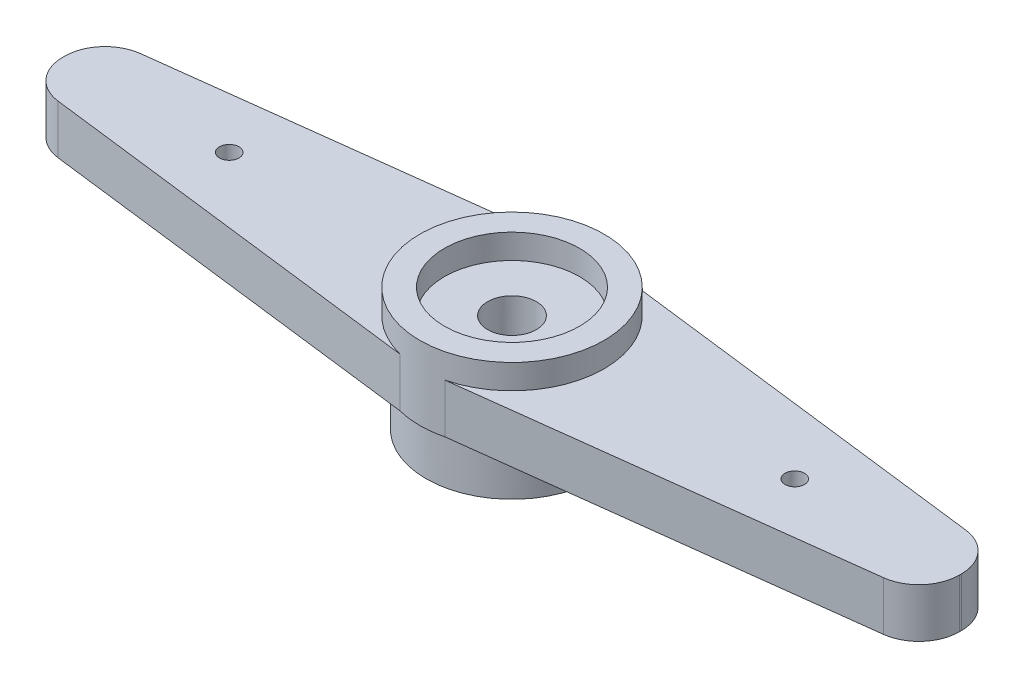
ISO-10303-21;
HEADER;
FILE_DESCRIPTION(('STEP AP214'),'2;1');
FILE_NAME('part.step','',(''),(''),'','','');
FILE_SCHEMA(('AUTOMOTIVE_DESIGN { 1 0 10303 214 1 1 1 1 }'));
ENDSEC;
DATA;
#1=APPLICATION_CONTEXT('core data for automotive mechanical design processes');
#2=APPLICATION_PROTOCOL_DEFINITION('international standard','automotive_design',2000,#1);
#3=PRODUCT_CONTEXT('',#1,'mechanical');
#4=PRODUCT('Part','Part','',(#3));
#5=PRODUCT_RELATED_PRODUCT_CATEGORY('part','',(#4));
#6=PRODUCT_DEFINITION_FORMATION('','',#4);
#7=PRODUCT_DEFINITION_CONTEXT('part definition',#1,'design');
#8=PRODUCT_DEFINITION('design','',#6,#7);
#9=PRODUCT_DEFINITION_SHAPE('','',#8);
#10=(LENGTH_UNIT() NAMED_UNIT(*) SI_UNIT(.MILLI.,.METRE.));
#11=(NAMED_UNIT(*) PLANE_ANGLE_UNIT() SI_UNIT($,.RADIAN.));
#12=(NAMED_UNIT(*) SI_UNIT($,.STERADIAN.) SOLID_ANGLE_UNIT());
#13=UNCERTAINTY_MEASURE_WITH_UNIT(LENGTH_MEASURE(1.E-05),#10,'distance_accuracy_value','');
#14=(GEOMETRIC_REPRESENTATION_CONTEXT(3) GLOBAL_UNCERTAINTY_ASSIGNED_CONTEXT((#13)) GLOBAL_UNIT_ASSIGNED_CONTEXT((#10,
#11,#12)) REPRESENTATION_CONTEXT('',''));
#15=CARTESIAN_POINT('',(0.,0.,0.));
#16=DIRECTION('',(0.,0.,1.));
#17=DIRECTION('',(1.,0.,0.));
#18=AXIS2_PLACEMENT_3D('',#15,#16,#17);
#19=CARTESIAN_POINT('',(-16.8022009519438,4.,-1.67531973664374));
#20=DIRECTION('',(-0.122546031481075,0.,-0.992462830623011));
#21=DIRECTION('',(-0.992462830623011,0.,0.122546031481075));
#22=AXIS2_PLACEMENT_3D('',#19,#20,#21);
#23=PLANE('',#22);
#24=DIRECTION('',(0.,1.,0.));
#25=VECTOR('',#24,1.);
#26=CARTESIAN_POINT('',(-0.912167859639924,3.,-3.6373685262618));
#27=LINE('',#26,#25);
#28=CARTESIAN_POINT('',(-0.912167859639935,4.,-3.63736852626179));
#29=VERTEX_POINT('',#28);
#30=CARTESIAN_POINT('',(-0.912167859639928,2.,-3.6373685262618));
#31=VERTEX_POINT('',#30);
#32=EDGE_CURVE('E241',#29,#31,#27,.F.);
#33=ORIENTED_EDGE('',*,*,#32,.T.);
#34=DIRECTION('',(0.992462830623011,0.,-0.122546031481075));
#35=VECTOR('',#34,1.);
#36=CARTESIAN_POINT('',(-16.8022009519438,2.,-1.67531973664374));
#37=LINE('',#36,#35);
#38=CARTESIAN_POINT('',(-16.8022009519438,2.,-1.67531973664374));
#39=VERTEX_POINT('',#38);
#40=EDGE_CURVE('E180',#39,#31,#37,.T.);
#41=ORIENTED_EDGE('',*,*,#40,.F.);
#42=DIRECTION('',(0.,-1.,0.));
#43=VECTOR('',#42,1.);
#44=CARTESIAN_POINT('',(-16.8022009519438,4.,-1.67531973664374));
#45=LINE('',#44,#43);
#46=CARTESIAN_POINT('',(-16.8022009519438,4.,-1.67531973664374));
#47=VERTEX_POINT('',#46);
#48=EDGE_CURVE('E209',#47,#39,#45,.T.);
#49=ORIENTED_EDGE('',*,*,#48,.F.);
#50=DIRECTION('',(0.992462830623011,0.,-0.122546031481075));
#51=VECTOR('',#50,1.);
#52=CARTESIAN_POINT('',(-16.8022009519438,4.,-1.67531973664374));
#53=LINE('',#52,#51);
#54=EDGE_CURVE('E189',#47,#29,#53,.T.);
#55=ORIENTED_EDGE('',*,*,#54,.T.);
#56=EDGE_LOOP('',(#33,#41,#49,#55));
#57=FACE_BOUND('',#56,.T.);
#58=ADVANCED_FACE('F39',(#57),#23,.T.);
#59=CARTESIAN_POINT('',(0.,4.,3.75));
#60=DIRECTION('',(-0.122546031481075,0.,0.992462830623011));
#61=DIRECTION('',(0.992462830623011,0.,0.122546031481075));
#62=AXIS2_PLACEMENT_3D('',#59,#60,#61);
#63=PLANE('',#62);
#64=DIRECTION('',(-0.992462830623011,0.,-0.122546031481075));
#65=VECTOR('',#64,1.);
#66=CARTESIAN_POINT('',(0.,2.,3.75));
#67=LINE('',#66,#65);
#68=CARTESIAN_POINT('',(-0.912167859639928,2.,3.6373685262618));
#69=VERTEX_POINT('',#68);
#70=CARTESIAN_POINT('',(-16.8022009519438,2.,1.67531973664374));
#71=VERTEX_POINT('',#70);
#72=EDGE_CURVE('E196',#69,#71,#67,.T.);
#73=ORIENTED_EDGE('',*,*,#72,.F.);
#74=DIRECTION('',(0.,1.,0.));
#75=VECTOR('',#74,1.);
#76=CARTESIAN_POINT('',(-0.912167859639924,3.,3.6373685262618));
#77=LINE('',#76,#75);
#78=CARTESIAN_POINT('',(-0.912167859639931,4.,3.6373685262618));
#79=VERTEX_POINT('',#78);
#80=EDGE_CURVE('E239',#69,#79,#77,.T.);
#81=ORIENTED_EDGE('',*,*,#80,.T.);
#82=DIRECTION('',(-0.992462830623011,0.,-0.122546031481075));
#83=VECTOR('',#82,1.);
#84=CARTESIAN_POINT('',(0.,4.,3.75));
#85=LINE('',#84,#83);
#86=CARTESIAN_POINT('',(-16.8022009519438,4.,1.67531973664374));
#87=VERTEX_POINT('',#86);
#88=EDGE_CURVE('E63',#79,#87,#85,.T.);
#89=ORIENTED_EDGE('',*,*,#88,.T.);
#90=DIRECTION('',(0.,-1.,0.));
#91=VECTOR('',#90,1.);
#92=CARTESIAN_POINT('',(-16.8022009519438,4.,1.67531973664374));
#93=LINE('',#92,#91);
#94=EDGE_CURVE('E192',#87,#71,#93,.T.);
#95=ORIENTED_EDGE('',*,*,#94,.T.);
#96=EDGE_LOOP('',(#73,#81,#89,#95));
#97=FACE_BOUND('',#96,.T.);
#98=ADVANCED_FACE('F273',(#97),#63,.T.);
#99=CARTESIAN_POINT('',(0.,3.,0.));
#100=DIRECTION('',(0.,1.,0.));
#101=DIRECTION('',(0.,0.,1.));
#102=AXIS2_PLACEMENT_3D('',#99,#100,#101);
#103=CYLINDRICAL_SURFACE('',#102,3.75);
#104=ORIENTED_EDGE('',*,*,#80,.F.);
#105=CARTESIAN_POINT('',(0.,2.,0.));
#106=DIRECTION('',(0.,-1.,0.));
#107=DIRECTION('',(0.,0.,-1.));
#108=AXIS2_PLACEMENT_3D('',#105,#106,#107);
#109=CIRCLE('',#108,3.75);
#110=CARTESIAN_POINT('',(0.912167859639931,2.,3.6373685262618));
#111=VERTEX_POINT('',#110);
#112=EDGE_CURVE('E173',#111,#69,#109,.T.);
#113=ORIENTED_EDGE('',*,*,#112,.F.);
#114=DIRECTION('',(0.,1.,0.));
#115=VECTOR('',#114,1.);
#116=CARTESIAN_POINT('',(0.912167859639924,3.,3.6373685262618));
#117=LINE('',#116,#115);
#118=CARTESIAN_POINT('',(0.912167859639931,4.,3.6373685262618));
#119=VERTEX_POINT('',#118);
#120=EDGE_CURVE('E11',#111,#119,#117,.T.);
#121=ORIENTED_EDGE('',*,*,#120,.T.);
#122=CARTESIAN_POINT('',(0.,4.,0.));
#123=DIRECTION('',(0.,-1.,0.));
#124=DIRECTION('',(0.,0.,-1.));
#125=AXIS2_PLACEMENT_3D('',#122,#123,#124);
#126=CIRCLE('',#125,3.75);
#127=CARTESIAN_POINT('',(0.912167859639935,4.,-3.63736852626179));
#128=VERTEX_POINT('',#127);
#129=EDGE_CURVE('E244',#119,#128,#126,.F.);
#130=ORIENTED_EDGE('',*,*,#129,.T.);
#131=DIRECTION('',(0.,1.,0.));
#132=VECTOR('',#131,1.);
#133=CARTESIAN_POINT('',(0.912167859639924,3.,-3.6373685262618));
#134=LINE('',#133,#132);
#135=CARTESIAN_POINT('',(0.912167859639935,2.,-3.63736852626179));
#136=VERTEX_POINT('',#135);
#137=EDGE_CURVE('E48',#128,#136,#134,.F.);
#138=ORIENTED_EDGE('',*,*,#137,.T.);
#139=EDGE_CURVE('E193',#31,#136,#109,.T.);
#140=ORIENTED_EDGE('',*,*,#139,.F.);
#141=ORIENTED_EDGE('',*,*,#32,.F.);
#142=CARTESIAN_POINT('',(0.,4.,0.));
#143=DIRECTION('',(0.,-1.,0.));
#144=DIRECTION('',(0.,0.,-1.));
#145=AXIS2_PLACEMENT_3D('',#142,#143,#144);
#146=CIRCLE('',#145,3.75);
#147=EDGE_CURVE('E211',#29,#79,#146,.F.);
#148=ORIENTED_EDGE('',*,*,#147,.T.);
#149=EDGE_LOOP('',(#104,#113,#121,#130,#138,#140,#141,#148));
#150=FACE_BOUND('',#149,.T.);
#151=CARTESIAN_POINT('',(0.,5.,0.));
#152=DIRECTION('',(0.,1.,0.));
#153=DIRECTION('',(0.,0.,1.));
#154=AXIS2_PLACEMENT_3D('',#151,#152,#153);
#155=CIRCLE('',#154,3.75);
#156=CARTESIAN_POINT('',(0.,5.,3.75));
#157=VERTEX_POINT('',#156);
#158=EDGE_CURVE('E227',#157,#157,#155,.T.);
#159=ORIENTED_EDGE('',*,*,#158,.F.);
#160=EDGE_LOOP('',(#159));
#161=FACE_BOUND('',#160,.T.);
#162=ADVANCED_FACE('F250',(#150,#161),#103,.T.);
#163=CARTESIAN_POINT('',(0.,2.,0.));
#164=DIRECTION('',(0.,-1.,0.));
#165=DIRECTION('',(0.,0.,-1.));
#166=AXIS2_PLACEMENT_3D('',#163,#164,#165);
#167=PLANE('',#166);
#168=CARTESIAN_POINT('',(11.509375,2.,0.));
#169=DIRECTION('',(0.,-1.,0.));
#170=DIRECTION('',(0.,0.,-1.));
#171=AXIS2_PLACEMENT_3D('',#168,#169,#170);
#172=CIRCLE('',#171,0.396875);
#173=CARTESIAN_POINT('',(11.509375,2.,-0.396875));
#174=VERTEX_POINT('',#173);
#175=EDGE_CURVE('E349',#174,#174,#172,.F.);
#176=ORIENTED_EDGE('',*,*,#175,.T.);
#177=EDGE_LOOP('',(#176));
#178=FACE_BOUND('',#177,.T.);
#179=CARTESIAN_POINT('',(-11.509375,2.,0.));
#180=DIRECTION('',(0.,-1.,0.));
#181=DIRECTION('',(0.,0.,-1.));
#182=AXIS2_PLACEMENT_3D('',#179,#180,#181);
#183=CIRCLE('',#182,0.396875);
#184=CARTESIAN_POINT('',(-11.509375,2.,-0.396875));
#185=VERTEX_POINT('',#184);
#186=EDGE_CURVE('E352',#185,#185,#183,.T.);
#187=ORIENTED_EDGE('',*,*,#186,.F.);
#188=EDGE_LOOP('',(#187));
#189=FACE_BOUND('',#188,.T.);
#190=ORIENTED_EDGE('',*,*,#112,.T.);
#191=ORIENTED_EDGE('',*,*,#72,.T.);
#192=CARTESIAN_POINT('',(-16.6,2.,0.0377560661157744));
#193=DIRECTION('',(0.,-1.,0.));
#194=DIRECTION('',(0.,0.,-1.));
#195=AXIS2_PLACEMENT_3D('',#192,#193,#194);
#196=CIRCLE('',#195,1.65);
#197=CARTESIAN_POINT('',(-18.25,2.,0.0377560661157645));
#198=VERTEX_POINT('',#197);
#199=EDGE_CURVE('E198',#71,#198,#196,.T.);
#200=ORIENTED_EDGE('',*,*,#199,.T.);
#201=DIRECTION('',(0.,0.,-1.));
#202=VECTOR('',#201,1.);
#203=CARTESIAN_POINT('',(-18.25,2.,0.0377560661157638));
#204=LINE('',#203,#202);
#205=CARTESIAN_POINT('',(-18.25,2.,-0.0377560661157642));
#206=VERTEX_POINT('',#205);
#207=EDGE_CURVE('E201',#198,#206,#204,.T.);
#208=ORIENTED_EDGE('',*,*,#207,.T.);
#209=CARTESIAN_POINT('',(-16.6,2.,-0.0377560661157749));
#210=DIRECTION('',(0.,-1.,0.));
#211=DIRECTION('',(0.,0.,1.));
#212=AXIS2_PLACEMENT_3D('',#209,#210,#211);
#213=CIRCLE('',#212,1.65);
#214=EDGE_CURVE('E204',#206,#39,#213,.T.);
#215=ORIENTED_EDGE('',*,*,#214,.T.);
#216=ORIENTED_EDGE('',*,*,#40,.T.);
#217=ORIENTED_EDGE('',*,*,#139,.T.);
#218=DIRECTION('',(-0.992462830623011,0.,-0.122546031481075));
#219=VECTOR('',#218,1.);
#220=CARTESIAN_POINT('',(16.8022009519438,2.,-1.67531973664374));
#221=LINE('',#220,#219);
#222=CARTESIAN_POINT('',(16.8022009519438,2.,-1.67531973664374));
#223=VERTEX_POINT('',#222);
#224=EDGE_CURVE('E164',#223,#136,#221,.T.);
#225=ORIENTED_EDGE('',*,*,#224,.F.);
#226=CARTESIAN_POINT('',(16.6,2.,-0.0377560661157749));
#227=DIRECTION('',(0.,1.,0.));
#228=DIRECTION('',(0.,0.,1.));
#229=AXIS2_PLACEMENT_3D('',#226,#227,#228);
#230=CIRCLE('',#229,1.65);
#231=CARTESIAN_POINT('',(18.25,2.,-0.0377560661157642));
#232=VERTEX_POINT('',#231);
#233=EDGE_CURVE('E145',#232,#223,#230,.T.);
#234=ORIENTED_EDGE('',*,*,#233,.F.);
#235=DIRECTION('',(0.,0.,-1.));
#236=VECTOR('',#235,1.);
#237=CARTESIAN_POINT('',(18.25,2.,0.0377560661157638));
#238=LINE('',#237,#236);
#239=CARTESIAN_POINT('',(18.25,2.,0.0377560661157645));
#240=VERTEX_POINT('',#239);
#241=EDGE_CURVE('E167',#240,#232,#238,.T.);
#242=ORIENTED_EDGE('',*,*,#241,.F.);
#243=CARTESIAN_POINT('',(16.6,2.,0.0377560661157744));
#244=DIRECTION('',(0.,1.,0.));
#245=DIRECTION('',(0.,0.,-1.));
#246=AXIS2_PLACEMENT_3D('',#243,#244,#245);
#247=CIRCLE('',#246,1.65);
#248=CARTESIAN_POINT('',(16.8022009519438,2.,1.67531973664374));
#249=VERTEX_POINT('',#248);
#250=EDGE_CURVE('E154',#249,#240,#247,.T.);
#251=ORIENTED_EDGE('',*,*,#250,.F.);
#252=DIRECTION('',(0.992462830623011,0.,-0.122546031481075));
#253=VECTOR('',#252,1.);
#254=CARTESIAN_POINT('',(0.,2.,3.75));
#255=LINE('',#254,#253);
#256=EDGE_CURVE('E55',#111,#249,#255,.T.);
#257=ORIENTED_EDGE('',*,*,#256,.F.);
#258=EDGE_LOOP('',(#190,#191,#200,#208,#215,#216,#217,#225,#234,#242,#251,#257));
#259=FACE_BOUND('',#258,.T.);
#260=CARTESIAN_POINT('',(0.,2.,0.));
#261=DIRECTION('',(0.,-1.,0.));
#262=DIRECTION('',(0.,0.,-1.));
#263=AXIS2_PLACEMENT_3D('',#260,#261,#262);
#264=CIRCLE('',#263,3.5);
#265=CARTESIAN_POINT('',(0.,2.,-3.5));
#266=VERTEX_POINT('',#265);
#267=EDGE_CURVE('E221',#266,#266,#264,.T.);
#268=ORIENTED_EDGE('',*,*,#267,.F.);
#269=EDGE_LOOP('',(#268));
#270=FACE_BOUND('',#269,.T.);
#271=ADVANCED_FACE('F253',(#178,#189,#259,#270),#167,.T.);
#272=CARTESIAN_POINT('',(-16.6,4.,-0.0377560661157749));
#273=DIRECTION('',(0.,-1.,0.));
#274=DIRECTION('',(0.,0.,-1.));
#275=AXIS2_PLACEMENT_3D('',#272,#273,#274);
#276=CYLINDRICAL_SURFACE('',#275,1.65);
#277=ORIENTED_EDGE('',*,*,#214,.F.);
#278=DIRECTION('',(0.,-1.,0.));
#279=VECTOR('',#278,1.);
#280=CARTESIAN_POINT('',(-18.25,4.,-0.0377560661157642));
#281=LINE('',#280,#279);
#282=CARTESIAN_POINT('',(-18.25,4.,-0.0377560661157642));
#283=VERTEX_POINT('',#282);
#284=EDGE_CURVE('E212',#283,#206,#281,.T.);
#285=ORIENTED_EDGE('',*,*,#284,.F.);
#286=CARTESIAN_POINT('',(-16.6,4.,-0.0377560661157749));
#287=DIRECTION('',(0.,-1.,0.));
#288=DIRECTION('',(0.,0.,1.));
#289=AXIS2_PLACEMENT_3D('',#286,#287,#288);
#290=CIRCLE('',#289,1.65);
#291=EDGE_CURVE('E186',#283,#47,#290,.T.);
#292=ORIENTED_EDGE('',*,*,#291,.T.);
#293=ORIENTED_EDGE('',*,*,#48,.T.);
#294=EDGE_LOOP('',(#277,#285,#292,#293));
#295=FACE_BOUND('',#294,.T.);
#296=ADVANCED_FACE('F303',(#295),#276,.T.);
#297=CARTESIAN_POINT('',(-18.25,4.,0.0377560661157638));
#298=DIRECTION('',(-1.,0.,0.));
#299=DIRECTION('',(0.,0.,1.));
#300=AXIS2_PLACEMENT_3D('',#297,#298,#299);
#301=PLANE('',#300);
#302=ORIENTED_EDGE('',*,*,#207,.F.);
#303=DIRECTION('',(0.,-1.,0.));
#304=VECTOR('',#303,1.);
#305=CARTESIAN_POINT('',(-18.25,4.,0.0377560661157645));
#306=LINE('',#305,#304);
#307=CARTESIAN_POINT('',(-18.25,4.,0.0377560661157645));
#308=VERTEX_POINT('',#307);
#309=EDGE_CURVE('E214',#308,#198,#306,.T.);
#310=ORIENTED_EDGE('',*,*,#309,.F.);
#311=DIRECTION('',(0.,0.,-1.));
#312=VECTOR('',#311,1.);
#313=CARTESIAN_POINT('',(-18.25,4.,0.0377560661157638));
#314=LINE('',#313,#312);
#315=EDGE_CURVE('E183',#308,#283,#314,.T.);
#316=ORIENTED_EDGE('',*,*,#315,.T.);
#317=ORIENTED_EDGE('',*,*,#284,.T.);
#318=EDGE_LOOP('',(#302,#310,#316,#317));
#319=FACE_BOUND('',#318,.T.);
#320=ADVANCED_FACE('F267',(#319),#301,.T.);
#321=CARTESIAN_POINT('',(-16.6,4.,0.0377560661157744));
#322=DIRECTION('',(0.,-1.,0.));
#323=DIRECTION('',(0.,0.,-1.));
#324=AXIS2_PLACEMENT_3D('',#321,#322,#323);
#325=CYLINDRICAL_SURFACE('',#324,1.65);
#326=ORIENTED_EDGE('',*,*,#199,.F.);
#327=ORIENTED_EDGE('',*,*,#94,.F.);
#328=CARTESIAN_POINT('',(-16.6,4.,0.0377560661157744));
#329=DIRECTION('',(0.,-1.,0.));
#330=DIRECTION('',(0.,0.,-1.));
#331=AXIS2_PLACEMENT_3D('',#328,#329,#330);
#332=CIRCLE('',#331,1.65);
#333=EDGE_CURVE('E179',#87,#308,#332,.T.);
#334=ORIENTED_EDGE('',*,*,#333,.T.);
#335=ORIENTED_EDGE('',*,*,#309,.T.);
#336=EDGE_LOOP('',(#326,#327,#334,#335));
#337=FACE_BOUND('',#336,.T.);
#338=ADVANCED_FACE('F270',(#337),#325,.T.);
#339=CARTESIAN_POINT('',(0.,4.,0.));
#340=DIRECTION('',(0.,-1.,0.));
#341=DIRECTION('',(0.,0.,-1.));
#342=AXIS2_PLACEMENT_3D('',#339,#340,#341);
#343=PLANE('',#342);
#344=CARTESIAN_POINT('',(-11.509375,4.,0.));
#345=DIRECTION('',(0.,1.,0.));
#346=DIRECTION('',(0.,0.,1.));
#347=AXIS2_PLACEMENT_3D('',#344,#345,#346);
#348=CIRCLE('',#347,0.396875);
#349=CARTESIAN_POINT('',(-11.509375,4.,0.396875));
#350=VERTEX_POINT('',#349);
#351=EDGE_CURVE('E354',#350,#350,#348,.T.);
#352=ORIENTED_EDGE('',*,*,#351,.F.);
#353=EDGE_LOOP('',(#352));
#354=FACE_BOUND('',#353,.T.);
#355=ORIENTED_EDGE('',*,*,#147,.F.);
#356=ORIENTED_EDGE('',*,*,#54,.F.);
#357=ORIENTED_EDGE('',*,*,#291,.F.);
#358=ORIENTED_EDGE('',*,*,#315,.F.);
#359=ORIENTED_EDGE('',*,*,#333,.F.);
#360=ORIENTED_EDGE('',*,*,#88,.F.);
#361=EDGE_LOOP('',(#355,#356,#357,#358,#359,#360));
#362=FACE_BOUND('',#361,.T.);
#363=ADVANCED_FACE('F261',(#354,#362),#343,.F.);
#364=CARTESIAN_POINT('',(0.,5.,0.));
#365=DIRECTION('',(0.,1.,0.));
#366=DIRECTION('',(0.,0.,1.));
#367=AXIS2_PLACEMENT_3D('',#364,#365,#366);
#368=PLANE('',#367);
#369=CARTESIAN_POINT('',(0.,5.,0.));
#370=DIRECTION('',(0.,1.,0.));
#371=DIRECTION('',(0.,0.,1.));
#372=AXIS2_PLACEMENT_3D('',#369,#370,#371);
#373=CIRCLE('',#372,2.75);
#374=CARTESIAN_POINT('',(0.,5.,2.75));
#375=VERTEX_POINT('',#374);
#376=EDGE_CURVE('E224',#375,#375,#373,.T.);
#377=ORIENTED_EDGE('',*,*,#376,.F.);
#378=EDGE_LOOP('',(#377));
#379=FACE_BOUND('',#378,.T.);
#380=ORIENTED_EDGE('',*,*,#158,.T.);
#381=EDGE_LOOP('',(#380));
#382=FACE_BOUND('',#381,.T.);
#383=ADVANCED_FACE('F313',(#379,#382),#368,.T.);
#384=CARTESIAN_POINT('',(0.,3.2,0.));
#385=DIRECTION('',(0.,1.,0.));
#386=DIRECTION('',(0.,0.,1.));
#387=AXIS2_PLACEMENT_3D('',#384,#385,#386);
#388=CYLINDRICAL_SURFACE('',#387,2.75);
#389=ORIENTED_EDGE('',*,*,#376,.T.);
#390=EDGE_LOOP('',(#389));
#391=FACE_BOUND('',#390,.T.);
#392=CARTESIAN_POINT('',(0.,4.,0.));
#393=DIRECTION('',(0.,-1.,0.));
#394=DIRECTION('',(0.,0.,-1.));
#395=AXIS2_PLACEMENT_3D('',#392,#393,#394);
#396=CIRCLE('',#395,2.75);
#397=CARTESIAN_POINT('',(0.,4.,-2.75));
#398=VERTEX_POINT('',#397);
#399=EDGE_CURVE('E236',#398,#398,#396,.F.);
#400=ORIENTED_EDGE('',*,*,#399,.F.);
#401=EDGE_LOOP('',(#400));
#402=FACE_BOUND('',#401,.T.);
#403=ADVANCED_FACE('F310',(#391,#402),#388,.F.);
#404=CARTESIAN_POINT('',(0.,5.,0.));
#405=DIRECTION('',(0.,-1.,0.));
#406=DIRECTION('',(0.,0.,-1.));
#407=AXIS2_PLACEMENT_3D('',#404,#405,#406);
#408=CYLINDRICAL_SURFACE('',#407,3.5);
#409=ORIENTED_EDGE('',*,*,#267,.T.);
#410=EDGE_LOOP('',(#409));
#411=FACE_BOUND('',#410,.T.);
#412=CARTESIAN_POINT('',(0.,0.,0.));
#413=DIRECTION('',(0.,1.,0.));
#414=DIRECTION('',(0.,0.,1.));
#415=AXIS2_PLACEMENT_3D('',#412,#413,#414);
#416=CIRCLE('',#415,3.5);
#417=CARTESIAN_POINT('',(0.,0.,3.5));
#418=VERTEX_POINT('',#417);
#419=EDGE_CURVE('E233',#418,#418,#416,.T.);
#420=ORIENTED_EDGE('',*,*,#419,.T.);
#421=EDGE_LOOP('',(#420));
#422=FACE_BOUND('',#421,.T.);
#423=ADVANCED_FACE('F41',(#411,#422),#408,.T.);
#424=CARTESIAN_POINT('',(0.,4.,0.));
#425=DIRECTION('',(0.,-1.,0.));
#426=DIRECTION('',(0.,0.,-1.));
#427=AXIS2_PLACEMENT_3D('',#424,#425,#426);
#428=CYLINDRICAL_SURFACE('',#427,3.);
#429=CARTESIAN_POINT('',(0.,2.,0.));
#430=DIRECTION('',(0.,-1.,0.));
#431=DIRECTION('',(0.,0.,-1.));
#432=AXIS2_PLACEMENT_3D('',#429,#430,#431);
#433=CIRCLE('',#432,3.);
#434=CARTESIAN_POINT('',(0.,2.,-3.));
#435=VERTEX_POINT('',#434);
#436=EDGE_CURVE('E220',#435,#435,#433,.F.);
#437=ORIENTED_EDGE('',*,*,#436,.T.);
#438=EDGE_LOOP('',(#437));
#439=FACE_BOUND('',#438,.T.);
#440=CARTESIAN_POINT('',(0.,0.,0.));
#441=DIRECTION('',(0.,-1.,0.));
#442=DIRECTION('',(0.,0.,-1.));
#443=AXIS2_PLACEMENT_3D('',#440,#441,#442);
#444=CIRCLE('',#443,3.);
#445=CARTESIAN_POINT('',(0.,0.,-3.));
#446=VERTEX_POINT('',#445);
#447=EDGE_CURVE('E230',#446,#446,#444,.T.);
#448=ORIENTED_EDGE('',*,*,#447,.T.);
#449=EDGE_LOOP('',(#448));
#450=FACE_BOUND('',#449,.T.);
#451=ADVANCED_FACE('F317',(#439,#450),#428,.F.);
#452=CARTESIAN_POINT('',(0.,0.,0.));
#453=DIRECTION('',(0.,1.,0.));
#454=DIRECTION('',(0.,0.,1.));
#455=AXIS2_PLACEMENT_3D('',#452,#453,#454);
#456=PLANE('',#455);
#457=ORIENTED_EDGE('',*,*,#447,.F.);
#458=EDGE_LOOP('',(#457));
#459=FACE_BOUND('',#458,.T.);
#460=ORIENTED_EDGE('',*,*,#419,.F.);
#461=EDGE_LOOP('',(#460));
#462=FACE_BOUND('',#461,.T.);
#463=ADVANCED_FACE('F319',(#459,#462),#456,.F.);
#464=CARTESIAN_POINT('',(0.,2.,0.));
#465=DIRECTION('',(0.,-1.,0.));
#466=DIRECTION('',(0.,0.,-1.));
#467=AXIS2_PLACEMENT_3D('',#464,#465,#466);
#468=CIRCLE('',#467,0.9906);
#469=CARTESIAN_POINT('',(0.,2.,-0.9906));
#470=VERTEX_POINT('',#469);
#471=EDGE_CURVE('E43',#470,#470,#468,.T.);
#472=ORIENTED_EDGE('',*,*,#471,.F.);
#473=EDGE_LOOP('',(#472));
#474=FACE_BOUND('',#473,.T.);
#475=ORIENTED_EDGE('',*,*,#436,.F.);
#476=EDGE_LOOP('',(#475));
#477=FACE_BOUND('',#476,.T.);
#478=ADVANCED_FACE('F324',(#474,#477),#167,.T.);
#479=CARTESIAN_POINT('',(0.,4.,0.));
#480=DIRECTION('',(0.,1.,0.));
#481=DIRECTION('',(0.,0.,1.));
#482=AXIS2_PLACEMENT_3D('',#479,#480,#481);
#483=CIRCLE('',#482,0.9906);
#484=CARTESIAN_POINT('',(0.,4.,0.9906));
#485=VERTEX_POINT('',#484);
#486=EDGE_CURVE('E157',#485,#485,#483,.T.);
#487=ORIENTED_EDGE('',*,*,#486,.F.);
#488=EDGE_LOOP('',(#487));
#489=FACE_BOUND('',#488,.T.);
#490=ORIENTED_EDGE('',*,*,#399,.T.);
#491=EDGE_LOOP('',(#490));
#492=FACE_BOUND('',#491,.T.);
#493=ADVANCED_FACE('F329',(#489,#492),#343,.F.);
#494=CARTESIAN_POINT('',(0.,4.,3.75));
#495=DIRECTION('',(-0.122546031481075,0.,-0.992462830623011));
#496=DIRECTION('',(-0.992462830623011,0.,0.122546031481075));
#497=AXIS2_PLACEMENT_3D('',#494,#495,#496);
#498=PLANE('',#497);
#499=ORIENTED_EDGE('',*,*,#120,.F.);
#500=ORIENTED_EDGE('',*,*,#256,.T.);
#501=DIRECTION('',(0.,-1.,0.));
#502=VECTOR('',#501,1.);
#503=CARTESIAN_POINT('',(16.8022009519438,4.,1.67531973664374));
#504=LINE('',#503,#502);
#505=CARTESIAN_POINT('',(16.8022009519438,4.,1.67531973664374));
#506=VERTEX_POINT('',#505);
#507=EDGE_CURVE('E170',#506,#249,#504,.T.);
#508=ORIENTED_EDGE('',*,*,#507,.F.);
#509=DIRECTION('',(0.992462830623011,0.,-0.122546031481075));
#510=VECTOR('',#509,1.);
#511=CARTESIAN_POINT('',(0.,4.,3.75));
#512=LINE('',#511,#510);
#513=EDGE_CURVE('E149',#119,#506,#512,.T.);
#514=ORIENTED_EDGE('',*,*,#513,.F.);
#515=EDGE_LOOP('',(#499,#500,#508,#514));
#516=FACE_BOUND('',#515,.T.);
#517=ADVANCED_FACE('F276',(#516),#498,.F.);
#518=CARTESIAN_POINT('',(16.6,4.,0.0377560661157744));
#519=DIRECTION('',(0.,-1.,0.));
#520=DIRECTION('',(0.,0.,-1.));
#521=AXIS2_PLACEMENT_3D('',#518,#519,#520);
#522=CYLINDRICAL_SURFACE('',#521,1.65);
#523=ORIENTED_EDGE('',*,*,#250,.T.);
#524=DIRECTION('',(0.,-1.,0.));
#525=VECTOR('',#524,1.);
#526=CARTESIAN_POINT('',(18.25,4.,0.0377560661157645));
#527=LINE('',#526,#525);
#528=CARTESIAN_POINT('',(18.25,4.,0.0377560661157645));
#529=VERTEX_POINT('',#528);
#530=EDGE_CURVE('E174',#529,#240,#527,.T.);
#531=ORIENTED_EDGE('',*,*,#530,.F.);
#532=CARTESIAN_POINT('',(16.6,4.,0.0377560661157744));
#533=DIRECTION('',(0.,1.,0.));
#534=DIRECTION('',(0.,0.,-1.));
#535=AXIS2_PLACEMENT_3D('',#532,#533,#534);
#536=CIRCLE('',#535,1.65);
#537=EDGE_CURVE('E161',#506,#529,#536,.T.);
#538=ORIENTED_EDGE('',*,*,#537,.F.);
#539=ORIENTED_EDGE('',*,*,#507,.T.);
#540=EDGE_LOOP('',(#523,#531,#538,#539));
#541=FACE_BOUND('',#540,.T.);
#542=ADVANCED_FACE('F281',(#541),#522,.T.);
#543=CARTESIAN_POINT('',(18.25,4.,0.0377560661157638));
#544=DIRECTION('',(-1.,0.,0.));
#545=DIRECTION('',(0.,0.,1.));
#546=AXIS2_PLACEMENT_3D('',#543,#544,#545);
#547=PLANE('',#546);
#548=ORIENTED_EDGE('',*,*,#241,.T.);
#549=DIRECTION('',(0.,-1.,0.));
#550=VECTOR('',#549,1.);
#551=CARTESIAN_POINT('',(18.25,4.,-0.0377560661157642));
#552=LINE('',#551,#550);
#553=CARTESIAN_POINT('',(18.25,4.,-0.0377560661157642));
#554=VERTEX_POINT('',#553);
#555=EDGE_CURVE('E148',#554,#232,#552,.T.);
#556=ORIENTED_EDGE('',*,*,#555,.F.);
#557=DIRECTION('',(0.,0.,-1.));
#558=VECTOR('',#557,1.);
#559=CARTESIAN_POINT('',(18.25,4.,0.0377560661157638));
#560=LINE('',#559,#558);
#561=EDGE_CURVE('E136',#529,#554,#560,.T.);
#562=ORIENTED_EDGE('',*,*,#561,.F.);
#563=ORIENTED_EDGE('',*,*,#530,.T.);
#564=EDGE_LOOP('',(#548,#556,#562,#563));
#565=FACE_BOUND('',#564,.T.);
#566=ADVANCED_FACE('F284',(#565),#547,.F.);
#567=CARTESIAN_POINT('',(16.6,4.,-0.0377560661157749));
#568=DIRECTION('',(0.,-1.,0.));
#569=DIRECTION('',(0.,0.,-1.));
#570=AXIS2_PLACEMENT_3D('',#567,#568,#569);
#571=CYLINDRICAL_SURFACE('',#570,1.65);
#572=ORIENTED_EDGE('',*,*,#233,.T.);
#573=DIRECTION('',(0.,-1.,0.));
#574=VECTOR('',#573,1.);
#575=CARTESIAN_POINT('',(16.8022009519438,4.,-1.67531973664374));
#576=LINE('',#575,#574);
#577=CARTESIAN_POINT('',(16.8022009519438,4.,-1.67531973664374));
#578=VERTEX_POINT('',#577);
#579=EDGE_CURVE('E142',#578,#223,#576,.T.);
#580=ORIENTED_EDGE('',*,*,#579,.F.);
#581=CARTESIAN_POINT('',(16.6,4.,-0.0377560661157749));
#582=DIRECTION('',(0.,1.,0.));
#583=DIRECTION('',(0.,0.,1.));
#584=AXIS2_PLACEMENT_3D('',#581,#582,#583);
#585=CIRCLE('',#584,1.65);
#586=EDGE_CURVE('E129',#554,#578,#585,.T.);
#587=ORIENTED_EDGE('',*,*,#586,.F.);
#588=ORIENTED_EDGE('',*,*,#555,.T.);
#589=EDGE_LOOP('',(#572,#580,#587,#588));
#590=FACE_BOUND('',#589,.T.);
#591=ADVANCED_FACE('F143',(#590),#571,.T.);
#592=CARTESIAN_POINT('',(16.8022009519438,4.,-1.67531973664374));
#593=DIRECTION('',(-0.122546031481075,0.,0.992462830623011));
#594=DIRECTION('',(0.992462830623011,0.,0.122546031481075));
#595=AXIS2_PLACEMENT_3D('',#592,#593,#594);
#596=PLANE('',#595);
#597=ORIENTED_EDGE('',*,*,#137,.F.);
#598=DIRECTION('',(-0.992462830623011,0.,-0.122546031481075));
#599=VECTOR('',#598,1.);
#600=CARTESIAN_POINT('',(16.8022009519438,4.,-1.67531973664374));
#601=LINE('',#600,#599);
#602=EDGE_CURVE('E133',#578,#128,#601,.T.);
#603=ORIENTED_EDGE('',*,*,#602,.F.);
#604=ORIENTED_EDGE('',*,*,#579,.T.);
#605=ORIENTED_EDGE('',*,*,#224,.T.);
#606=EDGE_LOOP('',(#597,#603,#604,#605));
#607=FACE_BOUND('',#606,.T.);
#608=ADVANCED_FACE('F151',(#607),#596,.F.);
#609=CARTESIAN_POINT('',(0.,4.,0.));
#610=DIRECTION('',(0.,-1.,0.));
#611=DIRECTION('',(0.,0.,-1.));
#612=AXIS2_PLACEMENT_3D('',#609,#610,#611);
#613=PLANE('',#612);
#614=CARTESIAN_POINT('',(11.509375,4.,0.));
#615=DIRECTION('',(0.,-1.,0.));
#616=DIRECTION('',(0.,0.,1.));
#617=AXIS2_PLACEMENT_3D('',#614,#615,#616);
#618=CIRCLE('',#617,0.396875);
#619=CARTESIAN_POINT('',(11.509375,4.,0.396875));
#620=VERTEX_POINT('',#619);
#621=EDGE_CURVE('E360',#620,#620,#618,.T.);
#622=ORIENTED_EDGE('',*,*,#621,.T.);
#623=EDGE_LOOP('',(#622));
#624=FACE_BOUND('',#623,.T.);
#625=ORIENTED_EDGE('',*,*,#129,.F.);
#626=ORIENTED_EDGE('',*,*,#513,.T.);
#627=ORIENTED_EDGE('',*,*,#537,.T.);
#628=ORIENTED_EDGE('',*,*,#561,.T.);
#629=ORIENTED_EDGE('',*,*,#586,.T.);
#630=ORIENTED_EDGE('',*,*,#602,.T.);
#631=EDGE_LOOP('',(#625,#626,#627,#628,#629,#630));
#632=FACE_BOUND('',#631,.T.);
#633=ADVANCED_FACE('F131',(#624,#632),#613,.F.);
#634=CARTESIAN_POINT('',(0.,0.,0.));
#635=DIRECTION('',(0.,1.,0.));
#636=DIRECTION('',(0.,0.,1.));
#637=AXIS2_PLACEMENT_3D('',#634,#635,#636);
#638=CYLINDRICAL_SURFACE('',#637,0.9906);
#639=ORIENTED_EDGE('',*,*,#471,.T.);
#640=EDGE_LOOP('',(#639));
#641=FACE_BOUND('',#640,.T.);
#642=ORIENTED_EDGE('',*,*,#486,.T.);
#643=EDGE_LOOP('',(#642));
#644=FACE_BOUND('',#643,.T.);
#645=ADVANCED_FACE('F372',(#641,#644),#638,.F.);
#646=CARTESIAN_POINT('',(-11.509375,0.,0.));
#647=DIRECTION('',(0.,1.,0.));
#648=DIRECTION('',(0.,0.,1.));
#649=AXIS2_PLACEMENT_3D('',#646,#647,#648);
#650=CYLINDRICAL_SURFACE('',#649,0.396875);
#651=ORIENTED_EDGE('',*,*,#186,.T.);
#652=EDGE_LOOP('',(#651));
#653=FACE_BOUND('',#652,.T.);
#654=ORIENTED_EDGE('',*,*,#351,.T.);
#655=EDGE_LOOP('',(#654));
#656=FACE_BOUND('',#655,.T.);
#657=ADVANCED_FACE('F367',(#653,#656),#650,.F.);
#658=CARTESIAN_POINT('',(11.509375,0.,0.));
#659=DIRECTION('',(0.,1.,0.));
#660=DIRECTION('',(0.,0.,1.));
#661=AXIS2_PLACEMENT_3D('',#658,#659,#660);
#662=CYLINDRICAL_SURFACE('',#661,0.396875);
#663=ORIENTED_EDGE('',*,*,#175,.F.);
#664=EDGE_LOOP('',(#663));
#665=FACE_BOUND('',#664,.T.);
#666=ORIENTED_EDGE('',*,*,#621,.F.);
#667=EDGE_LOOP('',(#666));
#668=FACE_BOUND('',#667,.T.);
#669=ADVANCED_FACE('F365',(#665,#668),#662,.F.);
#670=CLOSED_SHELL('',(#58,#98,#162,#271,#296,#320,#338,#363,#383,#403,#423,#451,#463,#478,#493,
#517,#542,#566,#591,#608,#633,#645,#657,#669));
#671=MANIFOLD_SOLID_BREP('B2',#670);
#672=ADVANCED_BREP_SHAPE_REPRESENTATION('',(#18,#671),#14);
#673=SHAPE_DEFINITION_REPRESENTATION(#9,#672);
ENDSEC;
END-ISO-10303-21;
